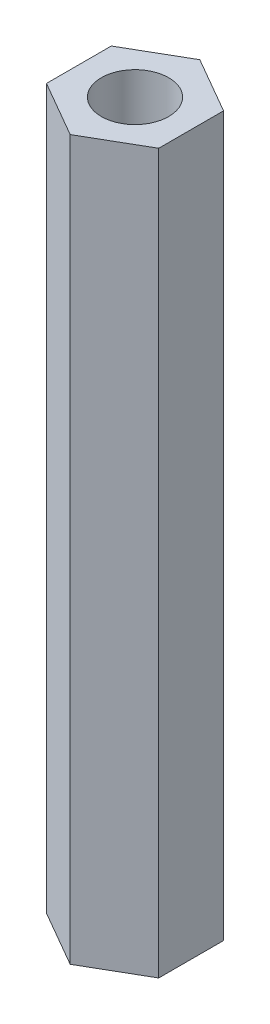
ISO-10303-21;
HEADER;
FILE_DESCRIPTION(('STEP AP214'),'2;1');
FILE_NAME('part.step','',(''),(''),'','','');
FILE_SCHEMA(('AUTOMOTIVE_DESIGN { 1 0 10303 214 1 1 1 1 }'));
ENDSEC;
DATA;
#1=APPLICATION_CONTEXT('core data for automotive mechanical design processes');
#2=APPLICATION_PROTOCOL_DEFINITION('international standard','automotive_design',2000,#1);
#3=PRODUCT_CONTEXT('',#1,'mechanical');
#4=PRODUCT('Part','Part','',(#3));
#5=PRODUCT_RELATED_PRODUCT_CATEGORY('part','',(#4));
#6=PRODUCT_DEFINITION_FORMATION('','',#4);
#7=PRODUCT_DEFINITION_CONTEXT('part definition',#1,'design');
#8=PRODUCT_DEFINITION('design','',#6,#7);
#9=PRODUCT_DEFINITION_SHAPE('','',#8);
#10=(LENGTH_UNIT() NAMED_UNIT(*) SI_UNIT(.MILLI.,.METRE.));
#11=(NAMED_UNIT(*) PLANE_ANGLE_UNIT() SI_UNIT($,.RADIAN.));
#12=(NAMED_UNIT(*) SI_UNIT($,.STERADIAN.) SOLID_ANGLE_UNIT());
#13=UNCERTAINTY_MEASURE_WITH_UNIT(LENGTH_MEASURE(1.E-05),#10,'distance_accuracy_value','');
#14=(GEOMETRIC_REPRESENTATION_CONTEXT(3) GLOBAL_UNCERTAINTY_ASSIGNED_CONTEXT((#13)) GLOBAL_UNIT_ASSIGNED_CONTEXT((#10,
#11,#12)) REPRESENTATION_CONTEXT('',''));
#15=CARTESIAN_POINT('',(0.,0.,0.));
#16=DIRECTION('',(0.,0.,1.));
#17=DIRECTION('',(1.,0.,0.));
#18=AXIS2_PLACEMENT_3D('',#15,#16,#17);
#19=CARTESIAN_POINT('',(2.49999999999998,32.,-1.44337567297407));
#20=DIRECTION('',(-0.5,0.,0.866025403784439));
#21=DIRECTION('',(0.866025403784439,0.,0.5));
#22=AXIS2_PLACEMENT_3D('',#19,#20,#21);
#23=PLANE('',#22);
#24=DIRECTION('',(-0.866025403784439,0.,-0.5));
#25=VECTOR('',#24,1.);
#26=CARTESIAN_POINT('',(2.49999999999998,0.,-1.44337567297407));
#27=LINE('',#26,#25);
#28=CARTESIAN_POINT('',(2.49999999999998,0.,-1.44337567297407));
#29=VERTEX_POINT('',#28);
#30=CARTESIAN_POINT('',(0.,0.,-2.88675134594812));
#31=VERTEX_POINT('',#30);
#32=EDGE_CURVE('E117',#29,#31,#27,.T.);
#33=ORIENTED_EDGE('',*,*,#32,.T.);
#34=DIRECTION('',(0.,-1.,0.));
#35=VECTOR('',#34,1.);
#36=CARTESIAN_POINT('',(0.,32.,-2.88675134594812));
#37=LINE('',#36,#35);
#38=CARTESIAN_POINT('',(0.,32.,-2.88675134594812));
#39=VERTEX_POINT('',#38);
#40=EDGE_CURVE('E11',#39,#31,#37,.T.);
#41=ORIENTED_EDGE('',*,*,#40,.F.);
#42=DIRECTION('',(-0.866025403784439,0.,-0.5));
#43=VECTOR('',#42,1.);
#44=CARTESIAN_POINT('',(2.49999999999998,32.,-1.44337567297407));
#45=LINE('',#44,#43);
#46=CARTESIAN_POINT('',(2.49999999999998,32.,-1.44337567297407));
#47=VERTEX_POINT('',#46);
#48=EDGE_CURVE('E128',#47,#39,#45,.T.);
#49=ORIENTED_EDGE('',*,*,#48,.F.);
#50=DIRECTION('',(0.,-1.,0.));
#51=VECTOR('',#50,1.);
#52=CARTESIAN_POINT('',(2.49999999999998,32.,-1.44337567297407));
#53=LINE('',#52,#51);
#54=EDGE_CURVE('E113',#47,#29,#53,.T.);
#55=ORIENTED_EDGE('',*,*,#54,.T.);
#56=EDGE_LOOP('',(#33,#41,#49,#55));
#57=FACE_BOUND('',#56,.T.);
#58=ADVANCED_FACE('F33',(#57),#23,.F.);
#59=CARTESIAN_POINT('',(0.,32.,-2.88675134594812));
#60=DIRECTION('',(0.499999999999999,0.,0.866025403784439));
#61=DIRECTION('',(0.866025403784439,0.,-0.499999999999999));
#62=AXIS2_PLACEMENT_3D('',#59,#60,#61);
#63=PLANE('',#62);
#64=DIRECTION('',(-0.866025403784439,0.,0.499999999999999));
#65=VECTOR('',#64,1.);
#66=CARTESIAN_POINT('',(0.,0.,-2.88675134594812));
#67=LINE('',#66,#65);
#68=CARTESIAN_POINT('',(-2.5,0.,-1.44337567297407));
#69=VERTEX_POINT('',#68);
#70=EDGE_CURVE('E120',#31,#69,#67,.T.);
#71=ORIENTED_EDGE('',*,*,#70,.T.);
#72=DIRECTION('',(0.,-1.,0.));
#73=VECTOR('',#72,1.);
#74=CARTESIAN_POINT('',(-2.5,32.,-1.44337567297407));
#75=LINE('',#74,#73);
#76=CARTESIAN_POINT('',(-2.5,32.,-1.44337567297407));
#77=VERTEX_POINT('',#76);
#78=EDGE_CURVE('E41',#77,#69,#75,.T.);
#79=ORIENTED_EDGE('',*,*,#78,.F.);
#80=DIRECTION('',(-0.866025403784439,0.,0.499999999999999));
#81=VECTOR('',#80,1.);
#82=CARTESIAN_POINT('',(0.,32.,-2.88675134594812));
#83=LINE('',#82,#81);
#84=EDGE_CURVE('E86',#39,#77,#83,.T.);
#85=ORIENTED_EDGE('',*,*,#84,.F.);
#86=ORIENTED_EDGE('',*,*,#40,.T.);
#87=EDGE_LOOP('',(#71,#79,#85,#86));
#88=FACE_BOUND('',#87,.T.);
#89=ADVANCED_FACE('F153',(#88),#63,.F.);
#90=CARTESIAN_POINT('',(-2.5,32.,-1.44337567297407));
#91=DIRECTION('',(1.,0.,0.));
#92=DIRECTION('',(0.,0.,-1.));
#93=AXIS2_PLACEMENT_3D('',#90,#91,#92);
#94=PLANE('',#93);
#95=DIRECTION('',(0.,0.,1.));
#96=VECTOR('',#95,1.);
#97=CARTESIAN_POINT('',(-2.5,0.,-1.44337567297407));
#98=LINE('',#97,#96);
#99=CARTESIAN_POINT('',(-2.5,0.,1.44337567297407));
#100=VERTEX_POINT('',#99);
#101=EDGE_CURVE('E123',#69,#100,#98,.T.);
#102=ORIENTED_EDGE('',*,*,#101,.T.);
#103=DIRECTION('',(0.,-1.,0.));
#104=VECTOR('',#103,1.);
#105=CARTESIAN_POINT('',(-2.5,32.,1.44337567297407));
#106=LINE('',#105,#104);
#107=CARTESIAN_POINT('',(-2.5,32.,1.44337567297407));
#108=VERTEX_POINT('',#107);
#109=EDGE_CURVE('E108',#108,#100,#106,.T.);
#110=ORIENTED_EDGE('',*,*,#109,.F.);
#111=DIRECTION('',(0.,0.,1.));
#112=VECTOR('',#111,1.);
#113=CARTESIAN_POINT('',(-2.5,32.,-1.44337567297407));
#114=LINE('',#113,#112);
#115=EDGE_CURVE('E99',#77,#108,#114,.T.);
#116=ORIENTED_EDGE('',*,*,#115,.F.);
#117=ORIENTED_EDGE('',*,*,#78,.T.);
#118=EDGE_LOOP('',(#102,#110,#116,#117));
#119=FACE_BOUND('',#118,.T.);
#120=ADVANCED_FACE('F134',(#119),#94,.F.);
#121=CARTESIAN_POINT('',(-2.5,32.,1.44337567297407));
#122=DIRECTION('',(0.499999999999999,0.,-0.866025403784439));
#123=DIRECTION('',(-0.866025403784439,0.,-0.499999999999999));
#124=AXIS2_PLACEMENT_3D('',#121,#122,#123);
#125=PLANE('',#124);
#126=DIRECTION('',(0.866025403784439,0.,0.499999999999999));
#127=VECTOR('',#126,1.);
#128=CARTESIAN_POINT('',(-2.5,0.,1.44337567297407));
#129=LINE('',#128,#127);
#130=CARTESIAN_POINT('',(0.,0.,2.88675134594812));
#131=VERTEX_POINT('',#130);
#132=EDGE_CURVE('E107',#100,#131,#129,.T.);
#133=ORIENTED_EDGE('',*,*,#132,.T.);
#134=DIRECTION('',(0.,-1.,0.));
#135=VECTOR('',#134,1.);
#136=CARTESIAN_POINT('',(0.,32.,2.88675134594812));
#137=LINE('',#136,#135);
#138=CARTESIAN_POINT('',(0.,32.,2.88675134594812));
#139=VERTEX_POINT('',#138);
#140=EDGE_CURVE('E104',#139,#131,#137,.T.);
#141=ORIENTED_EDGE('',*,*,#140,.F.);
#142=DIRECTION('',(0.866025403784439,0.,0.499999999999999));
#143=VECTOR('',#142,1.);
#144=CARTESIAN_POINT('',(-2.5,32.,1.44337567297407));
#145=LINE('',#144,#143);
#146=EDGE_CURVE('E93',#108,#139,#145,.T.);
#147=ORIENTED_EDGE('',*,*,#146,.F.);
#148=ORIENTED_EDGE('',*,*,#109,.T.);
#149=EDGE_LOOP('',(#133,#141,#147,#148));
#150=FACE_BOUND('',#149,.T.);
#151=ADVANCED_FACE('F105',(#150),#125,.F.);
#152=CARTESIAN_POINT('',(0.,32.,2.88675134594812));
#153=DIRECTION('',(-0.500000000000001,0.,-0.866025403784438));
#154=DIRECTION('',(-0.866025403784438,0.,0.500000000000001));
#155=AXIS2_PLACEMENT_3D('',#152,#153,#154);
#156=PLANE('',#155);
#157=DIRECTION('',(0.866025403784438,0.,-0.500000000000001));
#158=VECTOR('',#157,1.);
#159=CARTESIAN_POINT('',(0.,0.,2.88675134594812));
#160=LINE('',#159,#158);
#161=CARTESIAN_POINT('',(2.49999999999999,0.,1.44337567297407));
#162=VERTEX_POINT('',#161);
#163=EDGE_CURVE('E72',#131,#162,#160,.T.);
#164=ORIENTED_EDGE('',*,*,#163,.T.);
#165=DIRECTION('',(0.,-1.,0.));
#166=VECTOR('',#165,1.);
#167=CARTESIAN_POINT('',(2.49999999999999,32.,1.44337567297407));
#168=LINE('',#167,#166);
#169=CARTESIAN_POINT('',(2.49999999999999,32.,1.44337567297407));
#170=VERTEX_POINT('',#169);
#171=EDGE_CURVE('E109',#170,#162,#168,.T.);
#172=ORIENTED_EDGE('',*,*,#171,.F.);
#173=DIRECTION('',(0.866025403784438,0.,-0.500000000000001));
#174=VECTOR('',#173,1.);
#175=CARTESIAN_POINT('',(0.,32.,2.88675134594812));
#176=LINE('',#175,#174);
#177=EDGE_CURVE('E97',#139,#170,#176,.T.);
#178=ORIENTED_EDGE('',*,*,#177,.F.);
#179=ORIENTED_EDGE('',*,*,#140,.T.);
#180=EDGE_LOOP('',(#164,#172,#178,#179));
#181=FACE_BOUND('',#180,.T.);
#182=ADVANCED_FACE('F111',(#181),#156,.F.);
#183=CARTESIAN_POINT('',(2.49999999999999,32.,1.44337567297407));
#184=DIRECTION('',(-1.,0.,0.));
#185=DIRECTION('',(0.,0.,1.));
#186=AXIS2_PLACEMENT_3D('',#183,#184,#185);
#187=PLANE('',#186);
#188=DIRECTION('',(0.,0.,-1.));
#189=VECTOR('',#188,1.);
#190=CARTESIAN_POINT('',(2.49999999999999,0.,1.44337567297407));
#191=LINE('',#190,#189);
#192=EDGE_CURVE('E78',#162,#29,#191,.T.);
#193=ORIENTED_EDGE('',*,*,#192,.T.);
#194=ORIENTED_EDGE('',*,*,#54,.F.);
#195=DIRECTION('',(0.,0.,-1.));
#196=VECTOR('',#195,1.);
#197=CARTESIAN_POINT('',(2.49999999999999,32.,1.44337567297407));
#198=LINE('',#197,#196);
#199=EDGE_CURVE('E49',#170,#47,#198,.T.);
#200=ORIENTED_EDGE('',*,*,#199,.F.);
#201=ORIENTED_EDGE('',*,*,#171,.T.);
#202=EDGE_LOOP('',(#193,#194,#200,#201));
#203=FACE_BOUND('',#202,.T.);
#204=ADVANCED_FACE('F141',(#203),#187,.F.);
#205=CARTESIAN_POINT('',(0.,32.,-2.88675134594812));
#206=DIRECTION('',(0.,1.,0.));
#207=DIRECTION('',(0.,0.,1.));
#208=AXIS2_PLACEMENT_3D('',#205,#206,#207);
#209=PLANE('',#208);
#210=CARTESIAN_POINT('',(0.,32.,0.));
#211=DIRECTION('',(0.,1.,0.));
#212=DIRECTION('',(0.,0.,1.));
#213=AXIS2_PLACEMENT_3D('',#210,#211,#212);
#214=CIRCLE('',#213,1.5);
#215=CARTESIAN_POINT('',(0.,32.,1.5));
#216=VERTEX_POINT('',#215);
#217=EDGE_CURVE('E206',#216,#216,#214,.T.);
#218=ORIENTED_EDGE('',*,*,#217,.F.);
#219=EDGE_LOOP('',(#218));
#220=FACE_BOUND('',#219,.T.);
#221=ORIENTED_EDGE('',*,*,#48,.T.);
#222=ORIENTED_EDGE('',*,*,#84,.T.);
#223=ORIENTED_EDGE('',*,*,#115,.T.);
#224=ORIENTED_EDGE('',*,*,#146,.T.);
#225=ORIENTED_EDGE('',*,*,#177,.T.);
#226=ORIENTED_EDGE('',*,*,#199,.T.);
#227=EDGE_LOOP('',(#221,#222,#223,#224,#225,#226));
#228=FACE_BOUND('',#227,.T.);
#229=ADVANCED_FACE('F95',(#220,#228),#209,.T.);
#230=CARTESIAN_POINT('',(0.,0.,-2.88675134594812));
#231=DIRECTION('',(0.,1.,0.));
#232=DIRECTION('',(0.,0.,1.));
#233=AXIS2_PLACEMENT_3D('',#230,#231,#232);
#234=PLANE('',#233);
#235=CARTESIAN_POINT('',(0.,0.,0.));
#236=DIRECTION('',(0.,1.,0.));
#237=DIRECTION('',(0.,0.,1.));
#238=AXIS2_PLACEMENT_3D('',#235,#236,#237);
#239=CIRCLE('',#238,1.5);
#240=CARTESIAN_POINT('',(0.,0.,1.5));
#241=VERTEX_POINT('',#240);
#242=EDGE_CURVE('E121',#241,#241,#239,.F.);
#243=ORIENTED_EDGE('',*,*,#242,.F.);
#244=EDGE_LOOP('',(#243));
#245=FACE_BOUND('',#244,.T.);
#246=ORIENTED_EDGE('',*,*,#32,.F.);
#247=ORIENTED_EDGE('',*,*,#192,.F.);
#248=ORIENTED_EDGE('',*,*,#163,.F.);
#249=ORIENTED_EDGE('',*,*,#132,.F.);
#250=ORIENTED_EDGE('',*,*,#101,.F.);
#251=ORIENTED_EDGE('',*,*,#70,.F.);
#252=EDGE_LOOP('',(#246,#247,#248,#249,#250,#251));
#253=FACE_BOUND('',#252,.T.);
#254=ADVANCED_FACE('F137',(#245,#253),#234,.F.);
#255=CARTESIAN_POINT('',(0.,-0.001000000000001,0.));
#256=DIRECTION('',(0.,1.,0.));
#257=DIRECTION('',(0.,0.,1.));
#258=AXIS2_PLACEMENT_3D('',#255,#256,#257);
#259=CYLINDRICAL_SURFACE('',#258,1.5);
#260=ORIENTED_EDGE('',*,*,#217,.T.);
#261=EDGE_LOOP('',(#260));
#262=FACE_BOUND('',#261,.T.);
#263=ORIENTED_EDGE('',*,*,#242,.T.);
#264=EDGE_LOOP('',(#263));
#265=FACE_BOUND('',#264,.T.);
#266=ADVANCED_FACE('F190',(#262,#265),#259,.F.);
#267=CLOSED_SHELL('',(#58,#89,#120,#151,#182,#204,#229,#254,#266));
#268=MANIFOLD_SOLID_BREP('B2',#267);
#269=ADVANCED_BREP_SHAPE_REPRESENTATION('',(#18,#268),#14);
#270=SHAPE_DEFINITION_REPRESENTATION(#9,#269);
ENDSEC;
END-ISO-10303-21;
